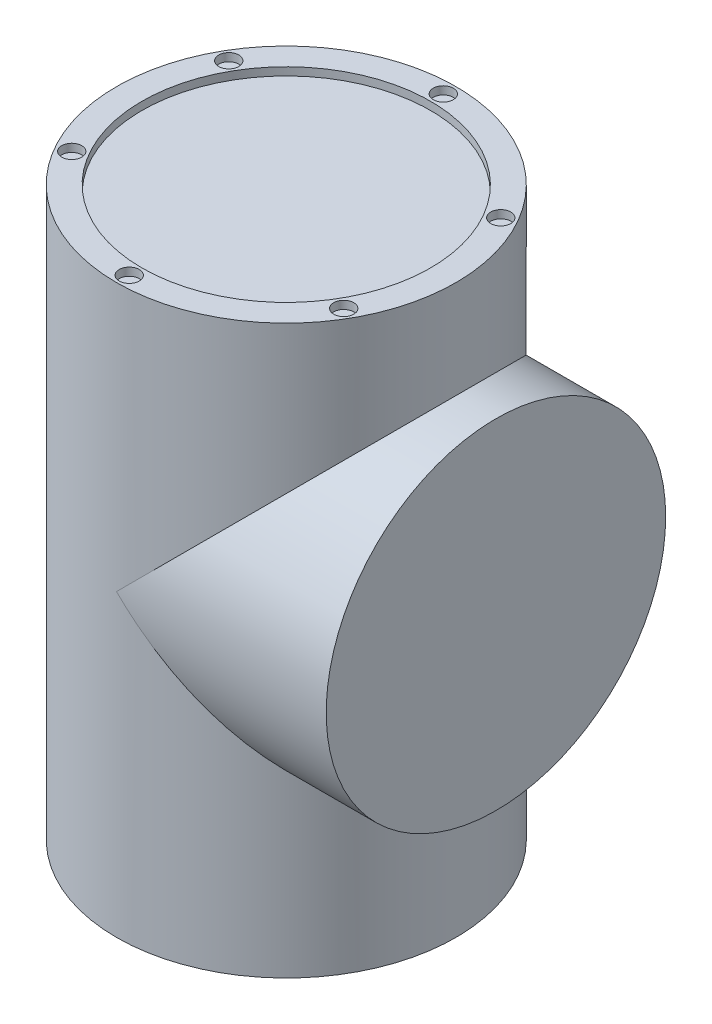
ISO-10303-21;
HEADER;
FILE_DESCRIPTION(('STEP AP214'),'2;1');
FILE_NAME('part.step','',(''),(''),'','','');
FILE_SCHEMA(('AUTOMOTIVE_DESIGN { 1 0 10303 214 1 1 1 1 }'));
ENDSEC;
DATA;
#1=APPLICATION_CONTEXT('core data for automotive mechanical design processes');
#2=APPLICATION_PROTOCOL_DEFINITION('international standard','automotive_design',2000,#1);
#3=PRODUCT_CONTEXT('',#1,'mechanical');
#4=PRODUCT('Part','Part','',(#3));
#5=PRODUCT_RELATED_PRODUCT_CATEGORY('part','',(#4));
#6=PRODUCT_DEFINITION_FORMATION('','',#4);
#7=PRODUCT_DEFINITION_CONTEXT('part definition',#1,'design');
#8=PRODUCT_DEFINITION('design','',#6,#7);
#9=PRODUCT_DEFINITION_SHAPE('','',#8);
#10=(LENGTH_UNIT() NAMED_UNIT(*) SI_UNIT(.MILLI.,.METRE.));
#11=(NAMED_UNIT(*) PLANE_ANGLE_UNIT() SI_UNIT($,.RADIAN.));
#12=(NAMED_UNIT(*) SI_UNIT($,.STERADIAN.) SOLID_ANGLE_UNIT());
#13=UNCERTAINTY_MEASURE_WITH_UNIT(LENGTH_MEASURE(1.E-05),#10,'distance_accuracy_value','');
#14=(GEOMETRIC_REPRESENTATION_CONTEXT(3) GLOBAL_UNCERTAINTY_ASSIGNED_CONTEXT((#13)) GLOBAL_UNIT_ASSIGNED_CONTEXT((#10,
#11,#12)) REPRESENTATION_CONTEXT('',''));
#15=CARTESIAN_POINT('',(0.,0.,0.));
#16=DIRECTION('',(0.,0.,1.));
#17=DIRECTION('',(1.,0.,0.));
#18=AXIS2_PLACEMENT_3D('',#15,#16,#17);
#19=CARTESIAN_POINT('',(0.,140.,0.));
#20=DIRECTION('',(0.,-1.,0.));
#21=DIRECTION('',(0.,0.,-1.));
#22=AXIS2_PLACEMENT_3D('',#19,#20,#21);
#23=CYLINDRICAL_SURFACE('',#22,42.5);
#24=CARTESIAN_POINT('',(0.,0.,0.));
#25=DIRECTION('',(0.,1.,0.));
#26=DIRECTION('',(0.,0.,1.));
#27=AXIS2_PLACEMENT_3D('',#24,#25,#26);
#28=CIRCLE('',#27,42.5);
#29=CARTESIAN_POINT('',(0.,0.,42.5));
#30=VERTEX_POINT('',#29);
#31=EDGE_CURVE('E75',#30,#30,#28,.T.);
#32=ORIENTED_EDGE('',*,*,#31,.T.);
#33=EDGE_LOOP('',(#32));
#34=FACE_BOUND('',#33,.T.);
#35=CARTESIAN_POINT('',(0.,75.,0.));
#36=DIRECTION('',(-0.707106781186547,-0.707106781186547,0.));
#37=DIRECTION('',(0.707106781186547,-0.707106781186547,0.));
#38=AXIS2_PLACEMENT_3D('',#35,#36,#37);
#39=ELLIPSE('',#38,60.1040764008566,42.5);
#40=CARTESIAN_POINT('',(0.,75.,42.5));
#41=VERTEX_POINT('',#40);
#42=CARTESIAN_POINT('',(0.,75.,-42.5));
#43=VERTEX_POINT('',#42);
#44=EDGE_CURVE('E67',#41,#43,#39,.F.);
#45=ORIENTED_EDGE('',*,*,#44,.F.);
#46=CARTESIAN_POINT('',(0.,75.,0.));
#47=DIRECTION('',(0.707106781186547,-0.707106781186547,0.));
#48=DIRECTION('',(-0.707106781186547,-0.707106781186547,0.));
#49=AXIS2_PLACEMENT_3D('',#46,#47,#48);
#50=ELLIPSE('',#49,60.1040764008566,42.5);
#51=EDGE_CURVE('E65',#43,#41,#50,.T.);
#52=ORIENTED_EDGE('',*,*,#51,.F.);
#53=EDGE_LOOP('',(#45,#52));
#54=FACE_BOUND('',#53,.T.);
#55=CARTESIAN_POINT('',(0.,142.,0.));
#56=DIRECTION('',(0.,1.,0.));
#57=DIRECTION('',(0.,0.,1.));
#58=AXIS2_PLACEMENT_3D('',#55,#56,#57);
#59=CIRCLE('',#58,42.5);
#60=CARTESIAN_POINT('',(0.,142.,42.5));
#61=VERTEX_POINT('',#60);
#62=EDGE_CURVE('E210',#61,#61,#59,.T.);
#63=ORIENTED_EDGE('',*,*,#62,.F.);
#64=EDGE_LOOP('',(#63));
#65=FACE_BOUND('',#64,.T.);
#66=ADVANCED_FACE('F51',(#34,#54,#65),#23,.T.);
#67=CARTESIAN_POINT('',(0.,0.,0.));
#68=DIRECTION('',(0.,1.,0.));
#69=DIRECTION('',(0.,0.,1.));
#70=AXIS2_PLACEMENT_3D('',#67,#68,#69);
#71=PLANE('',#70);
#72=ORIENTED_EDGE('',*,*,#31,.F.);
#73=EDGE_LOOP('',(#72));
#74=FACE_BOUND('',#73,.T.);
#75=ADVANCED_FACE('F122',(#74),#71,.F.);
#76=CARTESIAN_POINT('',(52.5,75.,0.));
#77=DIRECTION('',(-1.,0.,0.));
#78=DIRECTION('',(0.,0.,1.));
#79=AXIS2_PLACEMENT_3D('',#76,#77,#78);
#80=CYLINDRICAL_SURFACE('',#79,42.5);
#81=CARTESIAN_POINT('',(52.5,75.,0.));
#82=DIRECTION('',(1.,0.,0.));
#83=DIRECTION('',(0.,0.,-1.));
#84=AXIS2_PLACEMENT_3D('',#81,#82,#83);
#85=CIRCLE('',#84,42.5);
#86=CARTESIAN_POINT('',(52.5,75.,-42.5));
#87=VERTEX_POINT('',#86);
#88=EDGE_CURVE('E79',#87,#87,#85,.T.);
#89=ORIENTED_EDGE('',*,*,#88,.F.);
#90=EDGE_LOOP('',(#89));
#91=FACE_BOUND('',#90,.T.);
#92=ORIENTED_EDGE('',*,*,#51,.T.);
#93=ORIENTED_EDGE('',*,*,#44,.T.);
#94=EDGE_LOOP('',(#92,#93));
#95=FACE_BOUND('',#94,.T.);
#96=ADVANCED_FACE('F73',(#91,#95),#80,.T.);
#97=CARTESIAN_POINT('',(52.5,75.,0.));
#98=DIRECTION('',(1.,0.,0.));
#99=DIRECTION('',(0.,0.,-1.));
#100=AXIS2_PLACEMENT_3D('',#97,#98,#99);
#101=PLANE('',#100);
#102=ORIENTED_EDGE('',*,*,#88,.T.);
#103=EDGE_LOOP('',(#102));
#104=FACE_BOUND('',#103,.T.);
#105=ADVANCED_FACE('F134',(#104),#101,.T.);
#106=CARTESIAN_POINT('',(0.,142.,0.));
#107=DIRECTION('',(0.,1.,0.));
#108=DIRECTION('',(0.,0.,1.));
#109=AXIS2_PLACEMENT_3D('',#106,#107,#108);
#110=PLANE('',#109);
#111=CARTESIAN_POINT('',(-34.0513042690047,142.,19.6595296859692));
#112=DIRECTION('',(0.,1.,0.));
#113=DIRECTION('',(0.,0.,1.));
#114=AXIS2_PLACEMENT_3D('',#111,#112,#113);
#115=CIRCLE('',#114,2.50817893346333);
#116=CARTESIAN_POINT('',(-34.0513042690047,142.,22.1677086194325));
#117=VERTEX_POINT('',#116);
#118=EDGE_CURVE('E184',#117,#117,#115,.T.);
#119=ORIENTED_EDGE('',*,*,#118,.F.);
#120=EDGE_LOOP('',(#119));
#121=FACE_BOUND('',#120,.T.);
#122=CARTESIAN_POINT('',(34.0513042690085,142.,19.6595296859685));
#123=DIRECTION('',(0.,1.,0.));
#124=DIRECTION('',(0.,0.,1.));
#125=AXIS2_PLACEMENT_3D('',#122,#123,#124);
#126=CIRCLE('',#125,2.50817893346231);
#127=CARTESIAN_POINT('',(34.0513042690085,142.,22.1677086194308));
#128=VERTEX_POINT('',#127);
#129=EDGE_CURVE('E194',#128,#128,#126,.T.);
#130=ORIENTED_EDGE('',*,*,#129,.F.);
#131=EDGE_LOOP('',(#130));
#132=FACE_BOUND('',#131,.T.);
#133=CARTESIAN_POINT('',(1.28161381428317E-12,142.,-39.3190593719376));
#134=DIRECTION('',(0.,1.,0.));
#135=DIRECTION('',(0.,0.,1.));
#136=AXIS2_PLACEMENT_3D('',#133,#134,#135);
#137=CIRCLE('',#136,2.50817893346016);
#138=CARTESIAN_POINT('',(1.28161381428317E-12,142.,-36.8108804384775));
#139=VERTEX_POINT('',#138);
#140=EDGE_CURVE('E202',#139,#139,#137,.T.);
#141=ORIENTED_EDGE('',*,*,#140,.F.);
#142=EDGE_LOOP('',(#141));
#143=FACE_BOUND('',#142,.T.);
#144=ORIENTED_EDGE('',*,*,#62,.T.);
#145=EDGE_LOOP('',(#144));
#146=FACE_BOUND('',#145,.T.);
#147=CARTESIAN_POINT('',(0.,142.,0.));
#148=DIRECTION('',(0.,1.,0.));
#149=DIRECTION('',(0.,0.,1.));
#150=AXIS2_PLACEMENT_3D('',#147,#148,#149);
#151=CIRCLE('',#150,36.1435952460319);
#152=CARTESIAN_POINT('',(0.,142.,36.1435952460319));
#153=VERTEX_POINT('',#152);
#154=EDGE_CURVE('E206',#153,#153,#151,.T.);
#155=ORIENTED_EDGE('',*,*,#154,.F.);
#156=EDGE_LOOP('',(#155));
#157=FACE_BOUND('',#156,.T.);
#158=CARTESIAN_POINT('',(34.0513042690081,142.,-19.6595296859692));
#159=DIRECTION('',(0.,1.,0.));
#160=DIRECTION('',(0.,0.,1.));
#161=AXIS2_PLACEMENT_3D('',#158,#159,#160);
#162=CIRCLE('',#161,2.50817893346063);
#163=CARTESIAN_POINT('',(34.0513042690081,142.,-17.1513507525085));
#164=VERTEX_POINT('',#163);
#165=EDGE_CURVE('E198',#164,#164,#162,.T.);
#166=ORIENTED_EDGE('',*,*,#165,.F.);
#167=EDGE_LOOP('',(#166));
#168=FACE_BOUND('',#167,.T.);
#169=CARTESIAN_POINT('',(2.05648523929315E-12,142.,39.3190593719376));
#170=DIRECTION('',(0.,1.,0.));
#171=DIRECTION('',(0.,0.,1.));
#172=AXIS2_PLACEMENT_3D('',#169,#170,#171);
#173=CIRCLE('',#172,2.50817893346361);
#174=CARTESIAN_POINT('',(2.05648523929315E-12,142.,41.8272383054012));
#175=VERTEX_POINT('',#174);
#176=EDGE_CURVE('E188',#175,#175,#173,.T.);
#177=ORIENTED_EDGE('',*,*,#176,.F.);
#178=EDGE_LOOP('',(#177));
#179=FACE_BOUND('',#178,.T.);
#180=CARTESIAN_POINT('',(-34.0513042690051,142.,-19.6595296859685));
#181=DIRECTION('',(0.,1.,0.));
#182=DIRECTION('',(0.,0.,1.));
#183=AXIS2_PLACEMENT_3D('',#180,#181,#182);
#184=CIRCLE('',#183,2.50817893346181);
#185=CARTESIAN_POINT('',(-34.0513042690051,142.,-17.1513507525067));
#186=VERTEX_POINT('',#185);
#187=EDGE_CURVE('E180',#186,#186,#184,.T.);
#188=ORIENTED_EDGE('',*,*,#187,.F.);
#189=EDGE_LOOP('',(#188));
#190=FACE_BOUND('',#189,.T.);
#191=ADVANCED_FACE('F138',(#121,#132,#143,#146,#157,#168,#179,#190),#110,.T.);
#192=CARTESIAN_POINT('',(0.,142.,0.));
#193=DIRECTION('',(0.,-1.,0.));
#194=DIRECTION('',(0.,0.,-1.));
#195=AXIS2_PLACEMENT_3D('',#192,#193,#194);
#196=CYLINDRICAL_SURFACE('',#195,36.1435952460319);
#197=ORIENTED_EDGE('',*,*,#154,.T.);
#198=EDGE_LOOP('',(#197));
#199=FACE_BOUND('',#198,.T.);
#200=CARTESIAN_POINT('',(0.,140.,0.));
#201=DIRECTION('',(0.,1.,0.));
#202=DIRECTION('',(0.,0.,1.));
#203=AXIS2_PLACEMENT_3D('',#200,#201,#202);
#204=CIRCLE('',#203,36.1435952460319);
#205=CARTESIAN_POINT('',(0.,140.,36.1435952460319));
#206=VERTEX_POINT('',#205);
#207=EDGE_CURVE('E11',#206,#206,#204,.F.);
#208=ORIENTED_EDGE('',*,*,#207,.T.);
#209=EDGE_LOOP('',(#208));
#210=FACE_BOUND('',#209,.T.);
#211=ADVANCED_FACE('F145',(#199,#210),#196,.F.);
#212=CARTESIAN_POINT('',(1.28161381428317E-12,142.,-39.3190593719376));
#213=DIRECTION('',(0.,-1.,0.));
#214=DIRECTION('',(0.,0.,-1.));
#215=AXIS2_PLACEMENT_3D('',#212,#213,#214);
#216=CYLINDRICAL_SURFACE('',#215,2.50817893346016);
#217=ORIENTED_EDGE('',*,*,#140,.T.);
#218=EDGE_LOOP('',(#217));
#219=FACE_BOUND('',#218,.T.);
#220=CARTESIAN_POINT('',(1.28161381428317E-12,140.,-39.3190593719376));
#221=DIRECTION('',(0.,1.,0.));
#222=DIRECTION('',(0.,0.,1.));
#223=AXIS2_PLACEMENT_3D('',#220,#221,#222);
#224=CIRCLE('',#223,2.50817893346016);
#225=CARTESIAN_POINT('',(1.28161381428317E-12,140.,-36.8108804384775));
#226=VERTEX_POINT('',#225);
#227=EDGE_CURVE('E59',#226,#226,#224,.F.);
#228=ORIENTED_EDGE('',*,*,#227,.T.);
#229=EDGE_LOOP('',(#228));
#230=FACE_BOUND('',#229,.T.);
#231=ADVANCED_FACE('F105',(#219,#230),#216,.F.);
#232=CARTESIAN_POINT('',(34.0513042690081,142.,-19.6595296859692));
#233=DIRECTION('',(0.,-1.,0.));
#234=DIRECTION('',(0.,0.,-1.));
#235=AXIS2_PLACEMENT_3D('',#232,#233,#234);
#236=CYLINDRICAL_SURFACE('',#235,2.50817893346063);
#237=ORIENTED_EDGE('',*,*,#165,.T.);
#238=EDGE_LOOP('',(#237));
#239=FACE_BOUND('',#238,.T.);
#240=CARTESIAN_POINT('',(34.0513042690081,140.,-19.6595296859692));
#241=DIRECTION('',(0.,1.,0.));
#242=DIRECTION('',(0.,0.,1.));
#243=AXIS2_PLACEMENT_3D('',#240,#241,#242);
#244=CIRCLE('',#243,2.50817893346063);
#245=CARTESIAN_POINT('',(34.0513042690081,140.,-17.1513507525085));
#246=VERTEX_POINT('',#245);
#247=EDGE_CURVE('E98',#246,#246,#244,.F.);
#248=ORIENTED_EDGE('',*,*,#247,.T.);
#249=EDGE_LOOP('',(#248));
#250=FACE_BOUND('',#249,.T.);
#251=ADVANCED_FACE('F152',(#239,#250),#236,.F.);
#252=CARTESIAN_POINT('',(34.0513042690085,142.,19.6595296859685));
#253=DIRECTION('',(0.,-1.,0.));
#254=DIRECTION('',(0.,0.,-1.));
#255=AXIS2_PLACEMENT_3D('',#252,#253,#254);
#256=CYLINDRICAL_SURFACE('',#255,2.50817893346231);
#257=ORIENTED_EDGE('',*,*,#129,.T.);
#258=EDGE_LOOP('',(#257));
#259=FACE_BOUND('',#258,.T.);
#260=CARTESIAN_POINT('',(34.0513042690085,140.,19.6595296859685));
#261=DIRECTION('',(0.,1.,0.));
#262=DIRECTION('',(0.,0.,1.));
#263=AXIS2_PLACEMENT_3D('',#260,#261,#262);
#264=CIRCLE('',#263,2.50817893346231);
#265=CARTESIAN_POINT('',(34.0513042690085,140.,22.1677086194308));
#266=VERTEX_POINT('',#265);
#267=EDGE_CURVE('E94',#266,#266,#264,.F.);
#268=ORIENTED_EDGE('',*,*,#267,.T.);
#269=EDGE_LOOP('',(#268));
#270=FACE_BOUND('',#269,.T.);
#271=ADVANCED_FACE('F156',(#259,#270),#256,.F.);
#272=CARTESIAN_POINT('',(2.05648523929315E-12,142.,39.3190593719376));
#273=DIRECTION('',(0.,-1.,0.));
#274=DIRECTION('',(0.,0.,-1.));
#275=AXIS2_PLACEMENT_3D('',#272,#273,#274);
#276=CYLINDRICAL_SURFACE('',#275,2.50817893346361);
#277=ORIENTED_EDGE('',*,*,#176,.T.);
#278=EDGE_LOOP('',(#277));
#279=FACE_BOUND('',#278,.T.);
#280=CARTESIAN_POINT('',(2.05648523929315E-12,140.,39.3190593719376));
#281=DIRECTION('',(0.,1.,0.));
#282=DIRECTION('',(0.,0.,1.));
#283=AXIS2_PLACEMENT_3D('',#280,#281,#282);
#284=CIRCLE('',#283,2.50817893346361);
#285=CARTESIAN_POINT('',(2.05648523929315E-12,140.,41.8272383054012));
#286=VERTEX_POINT('',#285);
#287=EDGE_CURVE('E90',#286,#286,#284,.F.);
#288=ORIENTED_EDGE('',*,*,#287,.T.);
#289=EDGE_LOOP('',(#288));
#290=FACE_BOUND('',#289,.T.);
#291=ADVANCED_FACE('F160',(#279,#290),#276,.F.);
#292=CARTESIAN_POINT('',(-34.0513042690047,142.,19.6595296859692));
#293=DIRECTION('',(0.,-1.,0.));
#294=DIRECTION('',(0.,0.,-1.));
#295=AXIS2_PLACEMENT_3D('',#292,#293,#294);
#296=CYLINDRICAL_SURFACE('',#295,2.50817893346333);
#297=ORIENTED_EDGE('',*,*,#118,.T.);
#298=EDGE_LOOP('',(#297));
#299=FACE_BOUND('',#298,.T.);
#300=CARTESIAN_POINT('',(-34.0513042690047,140.,19.6595296859692));
#301=DIRECTION('',(0.,1.,0.));
#302=DIRECTION('',(0.,0.,1.));
#303=AXIS2_PLACEMENT_3D('',#300,#301,#302);
#304=CIRCLE('',#303,2.50817893346333);
#305=CARTESIAN_POINT('',(-34.0513042690047,140.,22.1677086194325));
#306=VERTEX_POINT('',#305);
#307=EDGE_CURVE('E86',#306,#306,#304,.F.);
#308=ORIENTED_EDGE('',*,*,#307,.T.);
#309=EDGE_LOOP('',(#308));
#310=FACE_BOUND('',#309,.T.);
#311=ADVANCED_FACE('F164',(#299,#310),#296,.F.);
#312=CARTESIAN_POINT('',(-34.0513042690051,142.,-19.6595296859685));
#313=DIRECTION('',(0.,-1.,0.));
#314=DIRECTION('',(0.,0.,-1.));
#315=AXIS2_PLACEMENT_3D('',#312,#313,#314);
#316=CYLINDRICAL_SURFACE('',#315,2.50817893346181);
#317=ORIENTED_EDGE('',*,*,#187,.T.);
#318=EDGE_LOOP('',(#317));
#319=FACE_BOUND('',#318,.T.);
#320=CARTESIAN_POINT('',(-34.0513042690051,140.,-19.6595296859685));
#321=DIRECTION('',(0.,1.,0.));
#322=DIRECTION('',(0.,0.,1.));
#323=AXIS2_PLACEMENT_3D('',#320,#321,#322);
#324=CIRCLE('',#323,2.50817893346181);
#325=CARTESIAN_POINT('',(-34.0513042690051,140.,-17.1513507525067));
#326=VERTEX_POINT('',#325);
#327=EDGE_CURVE('E71',#326,#326,#324,.F.);
#328=ORIENTED_EDGE('',*,*,#327,.T.);
#329=EDGE_LOOP('',(#328));
#330=FACE_BOUND('',#329,.T.);
#331=ADVANCED_FACE('F168',(#319,#330),#316,.F.);
#332=CARTESIAN_POINT('',(0.,140.,0.));
#333=DIRECTION('',(0.,1.,0.));
#334=DIRECTION('',(0.,0.,1.));
#335=AXIS2_PLACEMENT_3D('',#332,#333,#334);
#336=PLANE('',#335);
#337=ORIENTED_EDGE('',*,*,#327,.F.);
#338=EDGE_LOOP('',(#337));
#339=FACE_BOUND('',#338,.T.);
#340=ADVANCED_FACE('F117',(#339),#336,.T.);
#341=ORIENTED_EDGE('',*,*,#307,.F.);
#342=EDGE_LOOP('',(#341));
#343=FACE_BOUND('',#342,.T.);
#344=ADVANCED_FACE('F175',(#343),#336,.T.);
#345=ORIENTED_EDGE('',*,*,#287,.F.);
#346=EDGE_LOOP('',(#345));
#347=FACE_BOUND('',#346,.T.);
#348=ADVANCED_FACE('F226',(#347),#336,.T.);
#349=ORIENTED_EDGE('',*,*,#267,.F.);
#350=EDGE_LOOP('',(#349));
#351=FACE_BOUND('',#350,.T.);
#352=ADVANCED_FACE('F118',(#351),#336,.T.);
#353=ORIENTED_EDGE('',*,*,#247,.F.);
#354=EDGE_LOOP('',(#353));
#355=FACE_BOUND('',#354,.T.);
#356=ADVANCED_FACE('F110',(#355),#336,.T.);
#357=ORIENTED_EDGE('',*,*,#227,.F.);
#358=EDGE_LOOP('',(#357));
#359=FACE_BOUND('',#358,.T.);
#360=ADVANCED_FACE('F107',(#359),#336,.T.);
#361=ORIENTED_EDGE('',*,*,#207,.F.);
#362=EDGE_LOOP('',(#361));
#363=FACE_BOUND('',#362,.T.);
#364=ADVANCED_FACE('F109',(#363),#336,.T.);
#365=CLOSED_SHELL('',(#66,#75,#96,#105,#191,#211,#231,#251,#271,#291,#311,#331,#340,#344,#348,
#352,#356,#360,#364));
#366=MANIFOLD_SOLID_BREP('B2',#365);
#367=ADVANCED_BREP_SHAPE_REPRESENTATION('',(#18,#366),#14);
#368=SHAPE_DEFINITION_REPRESENTATION(#9,#367);
ENDSEC;
END-ISO-10303-21;
